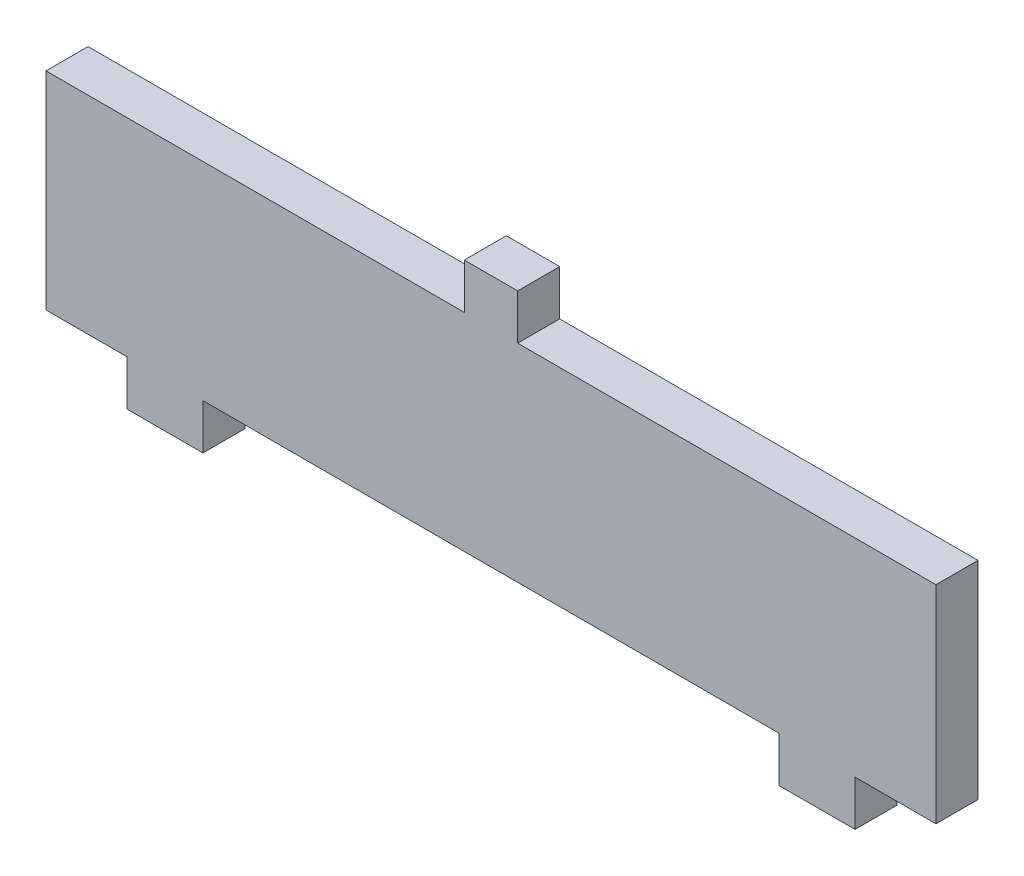
ISO-10303-21;
HEADER;
FILE_DESCRIPTION(('STEP AP214'),'2;1');
FILE_NAME('part.step','',(''),(''),'','','');
FILE_SCHEMA(('AUTOMOTIVE_DESIGN { 1 0 10303 214 1 1 1 1 }'));
ENDSEC;
DATA;
#1=APPLICATION_CONTEXT('core data for automotive mechanical design processes');
#2=APPLICATION_PROTOCOL_DEFINITION('international standard','automotive_design',2000,#1);
#3=PRODUCT_CONTEXT('',#1,'mechanical');
#4=PRODUCT('Part','Part','',(#3));
#5=PRODUCT_RELATED_PRODUCT_CATEGORY('part','',(#4));
#6=PRODUCT_DEFINITION_FORMATION('','',#4);
#7=PRODUCT_DEFINITION_CONTEXT('part definition',#1,'design');
#8=PRODUCT_DEFINITION('design','',#6,#7);
#9=PRODUCT_DEFINITION_SHAPE('','',#8);
#10=(LENGTH_UNIT() NAMED_UNIT(*) SI_UNIT(.MILLI.,.METRE.));
#11=(NAMED_UNIT(*) PLANE_ANGLE_UNIT() SI_UNIT($,.RADIAN.));
#12=(NAMED_UNIT(*) SI_UNIT($,.STERADIAN.) SOLID_ANGLE_UNIT());
#13=UNCERTAINTY_MEASURE_WITH_UNIT(LENGTH_MEASURE(1.E-05),#10,'distance_accuracy_value','');
#14=(GEOMETRIC_REPRESENTATION_CONTEXT(3) GLOBAL_UNCERTAINTY_ASSIGNED_CONTEXT((#13)) GLOBAL_UNIT_ASSIGNED_CONTEXT((#10,
#11,#12)) REPRESENTATION_CONTEXT('',''));
#15=CARTESIAN_POINT('',(0.,0.,0.));
#16=DIRECTION('',(0.,0.,1.));
#17=DIRECTION('',(1.,0.,0.));
#18=AXIS2_PLACEMENT_3D('',#15,#16,#17);
#19=CARTESIAN_POINT('',(-27.5,0.,-2.6));
#20=DIRECTION('',(-1.,0.,0.));
#21=DIRECTION('',(0.,0.,1.));
#22=AXIS2_PLACEMENT_3D('',#19,#20,#21);
#23=PLANE('',#22);
#24=DIRECTION('',(0.,-1.,0.));
#25=VECTOR('',#24,1.);
#26=CARTESIAN_POINT('',(-27.5,0.,0.));
#27=LINE('',#26,#25);
#28=CARTESIAN_POINT('',(-27.5,12.8,0.));
#29=VERTEX_POINT('',#28);
#30=CARTESIAN_POINT('',(-27.5,0.,0.));
#31=VERTEX_POINT('',#30);
#32=EDGE_CURVE('E183',#29,#31,#27,.T.);
#33=ORIENTED_EDGE('',*,*,#32,.F.);
#34=DIRECTION('',(0.,0.,1.));
#35=VECTOR('',#34,1.);
#36=CARTESIAN_POINT('',(-27.5,12.8,-2.6));
#37=LINE('',#36,#35);
#38=CARTESIAN_POINT('',(-27.5,12.8,-2.6));
#39=VERTEX_POINT('',#38);
#40=EDGE_CURVE('E11',#39,#29,#37,.T.);
#41=ORIENTED_EDGE('',*,*,#40,.F.);
#42=DIRECTION('',(0.,-1.,0.));
#43=VECTOR('',#42,1.);
#44=CARTESIAN_POINT('',(-27.5,0.,-2.6));
#45=LINE('',#44,#43);
#46=CARTESIAN_POINT('',(-27.5,0.,-2.6));
#47=VERTEX_POINT('',#46);
#48=EDGE_CURVE('E227',#39,#47,#45,.T.);
#49=ORIENTED_EDGE('',*,*,#48,.T.);
#50=DIRECTION('',(0.,0.,1.));
#51=VECTOR('',#50,1.);
#52=CARTESIAN_POINT('',(-27.5,0.,-2.6));
#53=LINE('',#52,#51);
#54=EDGE_CURVE('E41',#47,#31,#53,.T.);
#55=ORIENTED_EDGE('',*,*,#54,.T.);
#56=EDGE_LOOP('',(#33,#41,#49,#55));
#57=FACE_BOUND('',#56,.T.);
#58=ADVANCED_FACE('F38',(#57),#23,.T.);
#59=CARTESIAN_POINT('',(-27.5,12.8,-2.6));
#60=DIRECTION('',(0.,1.,0.));
#61=DIRECTION('',(-1.,0.,0.));
#62=AXIS2_PLACEMENT_3D('',#59,#60,#61);
#63=PLANE('',#62);
#64=DIRECTION('',(-1.,0.,0.));
#65=VECTOR('',#64,1.);
#66=CARTESIAN_POINT('',(-27.5,12.8,0.));
#67=LINE('',#66,#65);
#68=CARTESIAN_POINT('',(-1.65,12.8,0.));
#69=VERTEX_POINT('',#68);
#70=EDGE_CURVE('E225',#69,#29,#67,.T.);
#71=ORIENTED_EDGE('',*,*,#70,.F.);
#72=DIRECTION('',(0.,0.,1.));
#73=VECTOR('',#72,1.);
#74=CARTESIAN_POINT('',(-1.65,12.8,-2.6));
#75=LINE('',#74,#73);
#76=CARTESIAN_POINT('',(-1.65,12.8,-2.6));
#77=VERTEX_POINT('',#76);
#78=EDGE_CURVE('E47',#77,#69,#75,.T.);
#79=ORIENTED_EDGE('',*,*,#78,.F.);
#80=DIRECTION('',(-1.,0.,0.));
#81=VECTOR('',#80,1.);
#82=CARTESIAN_POINT('',(-27.5,12.8,-2.6));
#83=LINE('',#82,#81);
#84=EDGE_CURVE('E173',#77,#39,#83,.T.);
#85=ORIENTED_EDGE('',*,*,#84,.T.);
#86=ORIENTED_EDGE('',*,*,#40,.T.);
#87=EDGE_LOOP('',(#71,#79,#85,#86));
#88=FACE_BOUND('',#87,.T.);
#89=ADVANCED_FACE('F255',(#88),#63,.T.);
#90=CARTESIAN_POINT('',(-1.65,15.6,-2.6));
#91=DIRECTION('',(-1.,0.,0.));
#92=DIRECTION('',(0.,0.,1.));
#93=AXIS2_PLACEMENT_3D('',#90,#91,#92);
#94=PLANE('',#93);
#95=DIRECTION('',(0.,-1.,0.));
#96=VECTOR('',#95,1.);
#97=CARTESIAN_POINT('',(-1.65,15.6,0.));
#98=LINE('',#97,#96);
#99=CARTESIAN_POINT('',(-1.65,15.6,0.));
#100=VERTEX_POINT('',#99);
#101=EDGE_CURVE('E160',#100,#69,#98,.T.);
#102=ORIENTED_EDGE('',*,*,#101,.F.);
#103=DIRECTION('',(0.,0.,1.));
#104=VECTOR('',#103,1.);
#105=CARTESIAN_POINT('',(-1.65,15.6,-2.6));
#106=LINE('',#105,#104);
#107=CARTESIAN_POINT('',(-1.65,15.6,-2.6));
#108=VERTEX_POINT('',#107);
#109=EDGE_CURVE('E155',#108,#100,#106,.T.);
#110=ORIENTED_EDGE('',*,*,#109,.F.);
#111=DIRECTION('',(0.,-1.,0.));
#112=VECTOR('',#111,1.);
#113=CARTESIAN_POINT('',(-1.65,15.6,-2.6));
#114=LINE('',#113,#112);
#115=EDGE_CURVE('E158',#108,#77,#114,.T.);
#116=ORIENTED_EDGE('',*,*,#115,.T.);
#117=ORIENTED_EDGE('',*,*,#78,.T.);
#118=EDGE_LOOP('',(#102,#110,#116,#117));
#119=FACE_BOUND('',#118,.T.);
#120=ADVANCED_FACE('F157',(#119),#94,.T.);
#121=CARTESIAN_POINT('',(-1.65,15.6,-2.6));
#122=DIRECTION('',(0.,1.,0.));
#123=DIRECTION('',(0.,0.,1.));
#124=AXIS2_PLACEMENT_3D('',#121,#122,#123);
#125=PLANE('',#124);
#126=DIRECTION('',(-1.,0.,0.));
#127=VECTOR('',#126,1.);
#128=CARTESIAN_POINT('',(-1.65,15.6,0.));
#129=LINE('',#128,#127);
#130=CARTESIAN_POINT('',(1.65,15.6,0.));
#131=VERTEX_POINT('',#130);
#132=EDGE_CURVE('E222',#131,#100,#129,.T.);
#133=ORIENTED_EDGE('',*,*,#132,.F.);
#134=DIRECTION('',(0.,0.,1.));
#135=VECTOR('',#134,1.);
#136=CARTESIAN_POINT('',(1.65,15.6,-2.6));
#137=LINE('',#136,#135);
#138=CARTESIAN_POINT('',(1.65,15.6,-2.6));
#139=VERTEX_POINT('',#138);
#140=EDGE_CURVE('E165',#139,#131,#137,.T.);
#141=ORIENTED_EDGE('',*,*,#140,.F.);
#142=DIRECTION('',(-1.,0.,0.));
#143=VECTOR('',#142,1.);
#144=CARTESIAN_POINT('',(-1.65,15.6,-2.6));
#145=LINE('',#144,#143);
#146=EDGE_CURVE('E171',#139,#108,#145,.T.);
#147=ORIENTED_EDGE('',*,*,#146,.T.);
#148=ORIENTED_EDGE('',*,*,#109,.T.);
#149=EDGE_LOOP('',(#133,#141,#147,#148));
#150=FACE_BOUND('',#149,.T.);
#151=ADVANCED_FACE('F175',(#150),#125,.T.);
#152=CARTESIAN_POINT('',(1.65,15.6,-2.6));
#153=DIRECTION('',(1.,0.,0.));
#154=DIRECTION('',(0.,0.,-1.));
#155=AXIS2_PLACEMENT_3D('',#152,#153,#154);
#156=PLANE('',#155);
#157=DIRECTION('',(0.,1.,0.));
#158=VECTOR('',#157,1.);
#159=CARTESIAN_POINT('',(1.65,15.6,0.));
#160=LINE('',#159,#158);
#161=CARTESIAN_POINT('',(1.65,12.8,0.));
#162=VERTEX_POINT('',#161);
#163=EDGE_CURVE('E219',#162,#131,#160,.T.);
#164=ORIENTED_EDGE('',*,*,#163,.F.);
#165=DIRECTION('',(0.,0.,1.));
#166=VECTOR('',#165,1.);
#167=CARTESIAN_POINT('',(1.65,12.8,-2.6));
#168=LINE('',#167,#166);
#169=CARTESIAN_POINT('',(1.65,12.8,-2.6));
#170=VERTEX_POINT('',#169);
#171=EDGE_CURVE('E231',#170,#162,#168,.T.);
#172=ORIENTED_EDGE('',*,*,#171,.F.);
#173=DIRECTION('',(0.,1.,0.));
#174=VECTOR('',#173,1.);
#175=CARTESIAN_POINT('',(1.65,15.6,-2.6));
#176=LINE('',#175,#174);
#177=EDGE_CURVE('E176',#170,#139,#176,.T.);
#178=ORIENTED_EDGE('',*,*,#177,.T.);
#179=ORIENTED_EDGE('',*,*,#140,.T.);
#180=EDGE_LOOP('',(#164,#172,#178,#179));
#181=FACE_BOUND('',#180,.T.);
#182=ADVANCED_FACE('F268',(#181),#156,.T.);
#183=CARTESIAN_POINT('',(1.65,12.8,-2.6));
#184=DIRECTION('',(0.,1.,0.));
#185=DIRECTION('',(-1.,0.,0.));
#186=AXIS2_PLACEMENT_3D('',#183,#184,#185);
#187=PLANE('',#186);
#188=DIRECTION('',(-1.,0.,0.));
#189=VECTOR('',#188,1.);
#190=CARTESIAN_POINT('',(1.65,12.8,0.));
#191=LINE('',#190,#189);
#192=CARTESIAN_POINT('',(27.5,12.8,0.));
#193=VERTEX_POINT('',#192);
#194=EDGE_CURVE('E216',#193,#162,#191,.T.);
#195=ORIENTED_EDGE('',*,*,#194,.F.);
#196=DIRECTION('',(0.,0.,1.));
#197=VECTOR('',#196,1.);
#198=CARTESIAN_POINT('',(27.5,12.8,-2.6));
#199=LINE('',#198,#197);
#200=CARTESIAN_POINT('',(27.5,12.8,-2.6));
#201=VERTEX_POINT('',#200);
#202=EDGE_CURVE('E233',#201,#193,#199,.T.);
#203=ORIENTED_EDGE('',*,*,#202,.F.);
#204=DIRECTION('',(-1.,0.,0.));
#205=VECTOR('',#204,1.);
#206=CARTESIAN_POINT('',(1.65,12.8,-2.6));
#207=LINE('',#206,#205);
#208=EDGE_CURVE('E178',#201,#170,#207,.T.);
#209=ORIENTED_EDGE('',*,*,#208,.T.);
#210=ORIENTED_EDGE('',*,*,#171,.T.);
#211=EDGE_LOOP('',(#195,#203,#209,#210));
#212=FACE_BOUND('',#211,.T.);
#213=ADVANCED_FACE('F271',(#212),#187,.T.);
#214=CARTESIAN_POINT('',(27.5,0.,-2.6));
#215=DIRECTION('',(1.,0.,0.));
#216=DIRECTION('',(0.,1.,0.));
#217=AXIS2_PLACEMENT_3D('',#214,#215,#216);
#218=PLANE('',#217);
#219=DIRECTION('',(0.,1.,0.));
#220=VECTOR('',#219,1.);
#221=CARTESIAN_POINT('',(27.5,0.,0.));
#222=LINE('',#221,#220);
#223=CARTESIAN_POINT('',(27.5,0.,0.));
#224=VERTEX_POINT('',#223);
#225=EDGE_CURVE('E213',#224,#193,#222,.T.);
#226=ORIENTED_EDGE('',*,*,#225,.F.);
#227=DIRECTION('',(0.,0.,1.));
#228=VECTOR('',#227,1.);
#229=CARTESIAN_POINT('',(27.5,0.,-2.6));
#230=LINE('',#229,#228);
#231=CARTESIAN_POINT('',(27.5,0.,-2.6));
#232=VERTEX_POINT('',#231);
#233=EDGE_CURVE('E235',#232,#224,#230,.T.);
#234=ORIENTED_EDGE('',*,*,#233,.F.);
#235=DIRECTION('',(0.,1.,0.));
#236=VECTOR('',#235,1.);
#237=CARTESIAN_POINT('',(27.5,0.,-2.6));
#238=LINE('',#237,#236);
#239=EDGE_CURVE('E488',#232,#201,#238,.T.);
#240=ORIENTED_EDGE('',*,*,#239,.T.);
#241=ORIENTED_EDGE('',*,*,#202,.T.);
#242=EDGE_LOOP('',(#226,#234,#240,#241));
#243=FACE_BOUND('',#242,.T.);
#244=ADVANCED_FACE('F275',(#243),#218,.T.);
#245=CARTESIAN_POINT('',(22.5,0.,-2.6));
#246=DIRECTION('',(0.,-1.,0.));
#247=DIRECTION('',(1.,0.,0.));
#248=AXIS2_PLACEMENT_3D('',#245,#246,#247);
#249=PLANE('',#248);
#250=DIRECTION('',(1.,0.,0.));
#251=VECTOR('',#250,1.);
#252=CARTESIAN_POINT('',(22.5,0.,0.));
#253=LINE('',#252,#251);
#254=CARTESIAN_POINT('',(22.5,0.,0.));
#255=VERTEX_POINT('',#254);
#256=EDGE_CURVE('E210',#255,#224,#253,.T.);
#257=ORIENTED_EDGE('',*,*,#256,.F.);
#258=DIRECTION('',(0.,0.,1.));
#259=VECTOR('',#258,1.);
#260=CARTESIAN_POINT('',(22.5,0.,-2.6));
#261=LINE('',#260,#259);
#262=CARTESIAN_POINT('',(22.5,0.,-2.6));
#263=VERTEX_POINT('',#262);
#264=EDGE_CURVE('E237',#263,#255,#261,.T.);
#265=ORIENTED_EDGE('',*,*,#264,.F.);
#266=DIRECTION('',(1.,0.,0.));
#267=VECTOR('',#266,1.);
#268=CARTESIAN_POINT('',(22.5,0.,-2.6));
#269=LINE('',#268,#267);
#270=EDGE_CURVE('E484',#263,#232,#269,.T.);
#271=ORIENTED_EDGE('',*,*,#270,.T.);
#272=ORIENTED_EDGE('',*,*,#233,.T.);
#273=EDGE_LOOP('',(#257,#265,#271,#272));
#274=FACE_BOUND('',#273,.T.);
#275=ADVANCED_FACE('F279',(#274),#249,.T.);
#276=CARTESIAN_POINT('',(22.5,0.,-2.6));
#277=DIRECTION('',(1.,0.,0.));
#278=DIRECTION('',(0.,0.,-1.));
#279=AXIS2_PLACEMENT_3D('',#276,#277,#278);
#280=PLANE('',#279);
#281=DIRECTION('',(0.,1.,0.));
#282=VECTOR('',#281,1.);
#283=CARTESIAN_POINT('',(22.5,0.,0.));
#284=LINE('',#283,#282);
#285=CARTESIAN_POINT('',(22.5,-2.8,0.));
#286=VERTEX_POINT('',#285);
#287=EDGE_CURVE('E207',#286,#255,#284,.T.);
#288=ORIENTED_EDGE('',*,*,#287,.F.);
#289=DIRECTION('',(0.,0.,1.));
#290=VECTOR('',#289,1.);
#291=CARTESIAN_POINT('',(22.5,-2.8,-2.6));
#292=LINE('',#291,#290);
#293=CARTESIAN_POINT('',(22.5,-2.8,-2.6));
#294=VERTEX_POINT('',#293);
#295=EDGE_CURVE('E239',#294,#286,#292,.T.);
#296=ORIENTED_EDGE('',*,*,#295,.F.);
#297=DIRECTION('',(0.,1.,0.));
#298=VECTOR('',#297,1.);
#299=CARTESIAN_POINT('',(22.5,0.,-2.6));
#300=LINE('',#299,#298);
#301=EDGE_CURVE('E495',#294,#263,#300,.T.);
#302=ORIENTED_EDGE('',*,*,#301,.T.);
#303=ORIENTED_EDGE('',*,*,#264,.T.);
#304=EDGE_LOOP('',(#288,#296,#302,#303));
#305=FACE_BOUND('',#304,.T.);
#306=ADVANCED_FACE('F283',(#305),#280,.T.);
#307=CARTESIAN_POINT('',(22.5,-2.8,-2.6));
#308=DIRECTION('',(0.,-1.,0.));
#309=DIRECTION('',(0.,0.,-1.));
#310=AXIS2_PLACEMENT_3D('',#307,#308,#309);
#311=PLANE('',#310);
#312=DIRECTION('',(1.,0.,0.));
#313=VECTOR('',#312,1.);
#314=CARTESIAN_POINT('',(22.5,-2.8,0.));
#315=LINE('',#314,#313);
#316=CARTESIAN_POINT('',(17.8,-2.8,0.));
#317=VERTEX_POINT('',#316);
#318=EDGE_CURVE('E204',#317,#286,#315,.T.);
#319=ORIENTED_EDGE('',*,*,#318,.F.);
#320=DIRECTION('',(0.,0.,1.));
#321=VECTOR('',#320,1.);
#322=CARTESIAN_POINT('',(17.8,-2.8,-2.6));
#323=LINE('',#322,#321);
#324=CARTESIAN_POINT('',(17.8,-2.8,-2.6));
#325=VERTEX_POINT('',#324);
#326=EDGE_CURVE('E241',#325,#317,#323,.T.);
#327=ORIENTED_EDGE('',*,*,#326,.F.);
#328=DIRECTION('',(1.,0.,0.));
#329=VECTOR('',#328,1.);
#330=CARTESIAN_POINT('',(22.5,-2.8,-2.6));
#331=LINE('',#330,#329);
#332=EDGE_CURVE('E477',#325,#294,#331,.T.);
#333=ORIENTED_EDGE('',*,*,#332,.T.);
#334=ORIENTED_EDGE('',*,*,#295,.T.);
#335=EDGE_LOOP('',(#319,#327,#333,#334));
#336=FACE_BOUND('',#335,.T.);
#337=ADVANCED_FACE('F287',(#336),#311,.T.);
#338=CARTESIAN_POINT('',(17.8,0.,-2.6));
#339=DIRECTION('',(-1.,0.,0.));
#340=DIRECTION('',(0.,0.,1.));
#341=AXIS2_PLACEMENT_3D('',#338,#339,#340);
#342=PLANE('',#341);
#343=DIRECTION('',(0.,-1.,0.));
#344=VECTOR('',#343,1.);
#345=CARTESIAN_POINT('',(17.8,0.,0.));
#346=LINE('',#345,#344);
#347=CARTESIAN_POINT('',(17.8,0.,0.));
#348=VERTEX_POINT('',#347);
#349=EDGE_CURVE('E201',#348,#317,#346,.T.);
#350=ORIENTED_EDGE('',*,*,#349,.F.);
#351=DIRECTION('',(0.,0.,1.));
#352=VECTOR('',#351,1.);
#353=CARTESIAN_POINT('',(17.8,0.,-2.6));
#354=LINE('',#353,#352);
#355=CARTESIAN_POINT('',(17.8,0.,-2.6));
#356=VERTEX_POINT('',#355);
#357=EDGE_CURVE('E243',#356,#348,#354,.T.);
#358=ORIENTED_EDGE('',*,*,#357,.F.);
#359=DIRECTION('',(0.,-1.,0.));
#360=VECTOR('',#359,1.);
#361=CARTESIAN_POINT('',(17.8,0.,-2.6));
#362=LINE('',#361,#360);
#363=EDGE_CURVE('E473',#356,#325,#362,.T.);
#364=ORIENTED_EDGE('',*,*,#363,.T.);
#365=ORIENTED_EDGE('',*,*,#326,.T.);
#366=EDGE_LOOP('',(#350,#358,#364,#365));
#367=FACE_BOUND('',#366,.T.);
#368=ADVANCED_FACE('F291',(#367),#342,.T.);
#369=CARTESIAN_POINT('',(-17.8,0.,-2.6));
#370=DIRECTION('',(0.,-1.,0.));
#371=DIRECTION('',(0.,0.,-1.));
#372=AXIS2_PLACEMENT_3D('',#369,#370,#371);
#373=PLANE('',#372);
#374=DIRECTION('',(1.,0.,0.));
#375=VECTOR('',#374,1.);
#376=CARTESIAN_POINT('',(-17.8,0.,0.));
#377=LINE('',#376,#375);
#378=CARTESIAN_POINT('',(-17.8,0.,0.));
#379=VERTEX_POINT('',#378);
#380=EDGE_CURVE('E198',#379,#348,#377,.T.);
#381=ORIENTED_EDGE('',*,*,#380,.F.);
#382=DIRECTION('',(0.,0.,1.));
#383=VECTOR('',#382,1.);
#384=CARTESIAN_POINT('',(-17.8,0.,-2.6));
#385=LINE('',#384,#383);
#386=CARTESIAN_POINT('',(-17.8,0.,-2.6));
#387=VERTEX_POINT('',#386);
#388=EDGE_CURVE('E245',#387,#379,#385,.T.);
#389=ORIENTED_EDGE('',*,*,#388,.F.);
#390=DIRECTION('',(1.,0.,0.));
#391=VECTOR('',#390,1.);
#392=CARTESIAN_POINT('',(-17.8,0.,-2.6));
#393=LINE('',#392,#391);
#394=EDGE_CURVE('E499',#387,#356,#393,.T.);
#395=ORIENTED_EDGE('',*,*,#394,.T.);
#396=ORIENTED_EDGE('',*,*,#357,.T.);
#397=EDGE_LOOP('',(#381,#389,#395,#396));
#398=FACE_BOUND('',#397,.T.);
#399=ADVANCED_FACE('F295',(#398),#373,.T.);
#400=CARTESIAN_POINT('',(-17.8,0.,-2.6));
#401=DIRECTION('',(1.,0.,0.));
#402=DIRECTION('',(0.,0.,-1.));
#403=AXIS2_PLACEMENT_3D('',#400,#401,#402);
#404=PLANE('',#403);
#405=DIRECTION('',(0.,1.,0.));
#406=VECTOR('',#405,1.);
#407=CARTESIAN_POINT('',(-17.8,0.,0.));
#408=LINE('',#407,#406);
#409=CARTESIAN_POINT('',(-17.8,-2.8,0.));
#410=VERTEX_POINT('',#409);
#411=EDGE_CURVE('E195',#410,#379,#408,.T.);
#412=ORIENTED_EDGE('',*,*,#411,.F.);
#413=DIRECTION('',(0.,0.,1.));
#414=VECTOR('',#413,1.);
#415=CARTESIAN_POINT('',(-17.8,-2.8,-2.6));
#416=LINE('',#415,#414);
#417=CARTESIAN_POINT('',(-17.8,-2.8,-2.6));
#418=VERTEX_POINT('',#417);
#419=EDGE_CURVE('E247',#418,#410,#416,.T.);
#420=ORIENTED_EDGE('',*,*,#419,.F.);
#421=DIRECTION('',(0.,1.,0.));
#422=VECTOR('',#421,1.);
#423=CARTESIAN_POINT('',(-17.8,0.,-2.6));
#424=LINE('',#423,#422);
#425=EDGE_CURVE('E466',#418,#387,#424,.T.);
#426=ORIENTED_EDGE('',*,*,#425,.T.);
#427=ORIENTED_EDGE('',*,*,#388,.T.);
#428=EDGE_LOOP('',(#412,#420,#426,#427));
#429=FACE_BOUND('',#428,.T.);
#430=ADVANCED_FACE('F299',(#429),#404,.T.);
#431=CARTESIAN_POINT('',(-22.5,-2.8,-2.6));
#432=DIRECTION('',(0.,-1.,0.));
#433=DIRECTION('',(0.,0.,-1.));
#434=AXIS2_PLACEMENT_3D('',#431,#432,#433);
#435=PLANE('',#434);
#436=DIRECTION('',(1.,0.,0.));
#437=VECTOR('',#436,1.);
#438=CARTESIAN_POINT('',(-22.5,-2.8,0.));
#439=LINE('',#438,#437);
#440=CARTESIAN_POINT('',(-22.5,-2.8,0.));
#441=VERTEX_POINT('',#440);
#442=EDGE_CURVE('E192',#441,#410,#439,.T.);
#443=ORIENTED_EDGE('',*,*,#442,.F.);
#444=DIRECTION('',(0.,0.,1.));
#445=VECTOR('',#444,1.);
#446=CARTESIAN_POINT('',(-22.5,-2.8,-2.6));
#447=LINE('',#446,#445);
#448=CARTESIAN_POINT('',(-22.5,-2.8,-2.6));
#449=VERTEX_POINT('',#448);
#450=EDGE_CURVE('E249',#449,#441,#447,.T.);
#451=ORIENTED_EDGE('',*,*,#450,.F.);
#452=DIRECTION('',(1.,0.,0.));
#453=VECTOR('',#452,1.);
#454=CARTESIAN_POINT('',(-22.5,-2.8,-2.6));
#455=LINE('',#454,#453);
#456=EDGE_CURVE('E462',#449,#418,#455,.T.);
#457=ORIENTED_EDGE('',*,*,#456,.T.);
#458=ORIENTED_EDGE('',*,*,#419,.T.);
#459=EDGE_LOOP('',(#443,#451,#457,#458));
#460=FACE_BOUND('',#459,.T.);
#461=ADVANCED_FACE('F303',(#460),#435,.T.);
#462=CARTESIAN_POINT('',(-22.5,0.,-2.6));
#463=DIRECTION('',(-1.,0.,0.));
#464=DIRECTION('',(0.,0.,1.));
#465=AXIS2_PLACEMENT_3D('',#462,#463,#464);
#466=PLANE('',#465);
#467=DIRECTION('',(0.,-1.,0.));
#468=VECTOR('',#467,1.);
#469=CARTESIAN_POINT('',(-22.5,0.,0.));
#470=LINE('',#469,#468);
#471=CARTESIAN_POINT('',(-22.5,0.,0.));
#472=VERTEX_POINT('',#471);
#473=EDGE_CURVE('E189',#472,#441,#470,.T.);
#474=ORIENTED_EDGE('',*,*,#473,.F.);
#475=DIRECTION('',(0.,0.,1.));
#476=VECTOR('',#475,1.);
#477=CARTESIAN_POINT('',(-22.5,0.,-2.6));
#478=LINE('',#477,#476);
#479=CARTESIAN_POINT('',(-22.5,0.,-2.6));
#480=VERTEX_POINT('',#479);
#481=EDGE_CURVE('E250',#480,#472,#478,.T.);
#482=ORIENTED_EDGE('',*,*,#481,.F.);
#483=DIRECTION('',(0.,-1.,0.));
#484=VECTOR('',#483,1.);
#485=CARTESIAN_POINT('',(-22.5,0.,-2.6));
#486=LINE('',#485,#484);
#487=EDGE_CURVE('E503',#480,#449,#486,.T.);
#488=ORIENTED_EDGE('',*,*,#487,.T.);
#489=ORIENTED_EDGE('',*,*,#450,.T.);
#490=EDGE_LOOP('',(#474,#482,#488,#489));
#491=FACE_BOUND('',#490,.T.);
#492=ADVANCED_FACE('F307',(#491),#466,.T.);
#493=CARTESIAN_POINT('',(-27.5,0.,-2.6));
#494=DIRECTION('',(0.,-1.,0.));
#495=DIRECTION('',(0.,0.,-1.));
#496=AXIS2_PLACEMENT_3D('',#493,#494,#495);
#497=PLANE('',#496);
#498=DIRECTION('',(1.,0.,0.));
#499=VECTOR('',#498,1.);
#500=CARTESIAN_POINT('',(-27.5,0.,0.));
#501=LINE('',#500,#499);
#502=EDGE_CURVE('E186',#31,#472,#501,.T.);
#503=ORIENTED_EDGE('',*,*,#502,.F.);
#504=ORIENTED_EDGE('',*,*,#54,.F.);
#505=DIRECTION('',(1.,0.,0.));
#506=VECTOR('',#505,1.);
#507=CARTESIAN_POINT('',(-27.5,0.,-2.6));
#508=LINE('',#507,#506);
#509=EDGE_CURVE('E505',#47,#480,#508,.T.);
#510=ORIENTED_EDGE('',*,*,#509,.T.);
#511=ORIENTED_EDGE('',*,*,#481,.T.);
#512=EDGE_LOOP('',(#503,#504,#510,#511));
#513=FACE_BOUND('',#512,.T.);
#514=ADVANCED_FACE('F252',(#513),#497,.T.);
#515=CARTESIAN_POINT('',(0.,0.,-2.6));
#516=DIRECTION('',(0.,0.,-1.));
#517=DIRECTION('',(-1.,0.,0.));
#518=AXIS2_PLACEMENT_3D('',#515,#516,#517);
#519=PLANE('',#518);
#520=ORIENTED_EDGE('',*,*,#48,.F.);
#521=ORIENTED_EDGE('',*,*,#84,.F.);
#522=ORIENTED_EDGE('',*,*,#115,.F.);
#523=ORIENTED_EDGE('',*,*,#146,.F.);
#524=ORIENTED_EDGE('',*,*,#177,.F.);
#525=ORIENTED_EDGE('',*,*,#208,.F.);
#526=ORIENTED_EDGE('',*,*,#239,.F.);
#527=ORIENTED_EDGE('',*,*,#270,.F.);
#528=ORIENTED_EDGE('',*,*,#301,.F.);
#529=ORIENTED_EDGE('',*,*,#332,.F.);
#530=ORIENTED_EDGE('',*,*,#363,.F.);
#531=ORIENTED_EDGE('',*,*,#394,.F.);
#532=ORIENTED_EDGE('',*,*,#425,.F.);
#533=ORIENTED_EDGE('',*,*,#456,.F.);
#534=ORIENTED_EDGE('',*,*,#487,.F.);
#535=ORIENTED_EDGE('',*,*,#509,.F.);
#536=EDGE_LOOP('',(#520,#521,#522,#523,#524,#525,#526,#527,#528,#529,#530,#531,#532,#533,#534,#535));
#537=FACE_BOUND('',#536,.T.);
#538=ADVANCED_FACE('F169',(#537),#519,.T.);
#539=CARTESIAN_POINT('',(0.,0.,0.));
#540=DIRECTION('',(0.,0.,-1.));
#541=DIRECTION('',(-1.,0.,0.));
#542=AXIS2_PLACEMENT_3D('',#539,#540,#541);
#543=PLANE('',#542);
#544=ORIENTED_EDGE('',*,*,#32,.T.);
#545=ORIENTED_EDGE('',*,*,#502,.T.);
#546=ORIENTED_EDGE('',*,*,#473,.T.);
#547=ORIENTED_EDGE('',*,*,#442,.T.);
#548=ORIENTED_EDGE('',*,*,#411,.T.);
#549=ORIENTED_EDGE('',*,*,#380,.T.);
#550=ORIENTED_EDGE('',*,*,#349,.T.);
#551=ORIENTED_EDGE('',*,*,#318,.T.);
#552=ORIENTED_EDGE('',*,*,#287,.T.);
#553=ORIENTED_EDGE('',*,*,#256,.T.);
#554=ORIENTED_EDGE('',*,*,#225,.T.);
#555=ORIENTED_EDGE('',*,*,#194,.T.);
#556=ORIENTED_EDGE('',*,*,#163,.T.);
#557=ORIENTED_EDGE('',*,*,#132,.T.);
#558=ORIENTED_EDGE('',*,*,#101,.T.);
#559=ORIENTED_EDGE('',*,*,#70,.T.);
#560=EDGE_LOOP('',(#544,#545,#546,#547,#548,#549,#550,#551,#552,#553,#554,#555,#556,#557,#558,#559));
#561=FACE_BOUND('',#560,.T.);
#562=ADVANCED_FACE('F254',(#561),#543,.F.);
#563=CLOSED_SHELL('',(#58,#89,#120,#151,#182,#213,#244,#275,#306,#337,#368,#399,#430,#461,#492,
#514,#538,#562));
#564=MANIFOLD_SOLID_BREP('B2',#563);
#565=ADVANCED_BREP_SHAPE_REPRESENTATION('',(#18,#564),#14);
#566=SHAPE_DEFINITION_REPRESENTATION(#9,#565);
ENDSEC;
END-ISO-10303-21;
